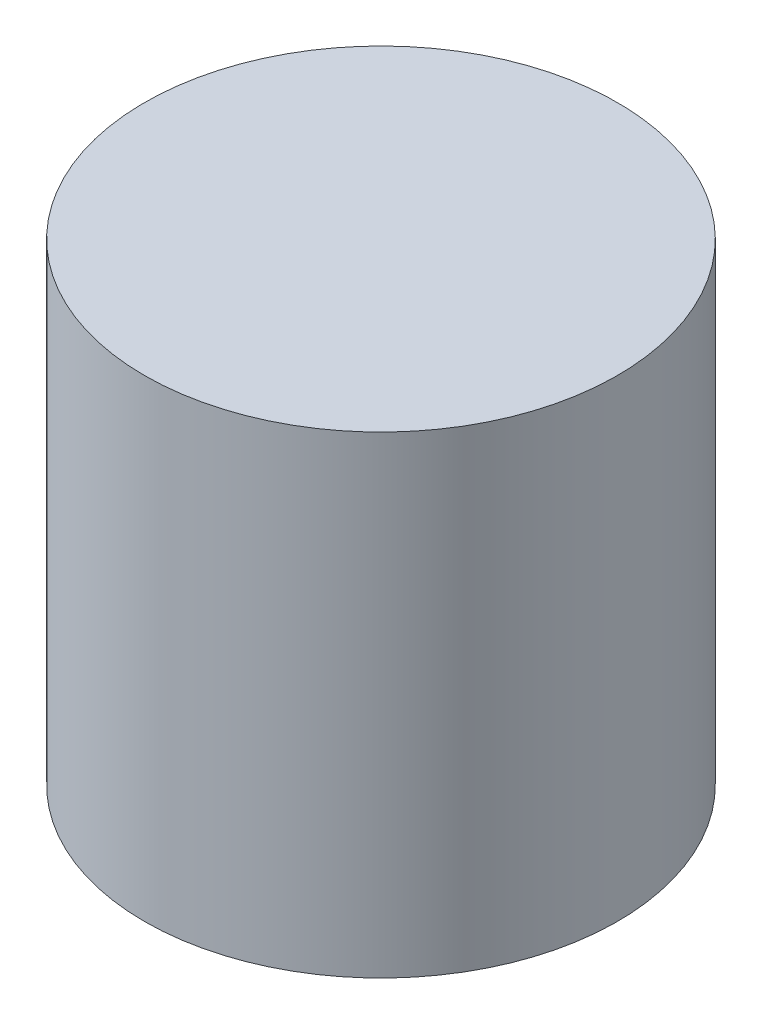
ISO-10303-21;
HEADER;
FILE_DESCRIPTION(('STEP AP214'),'2;1');
FILE_NAME('part.step','',(''),(''),'','','');
FILE_SCHEMA(('AUTOMOTIVE_DESIGN { 1 0 10303 214 1 1 1 1 }'));
ENDSEC;
DATA;
#1=APPLICATION_CONTEXT('core data for automotive mechanical design processes');
#2=APPLICATION_PROTOCOL_DEFINITION('international standard','automotive_design',2000,#1);
#3=PRODUCT_CONTEXT('',#1,'mechanical');
#4=PRODUCT('Part','Part','',(#3));
#5=PRODUCT_RELATED_PRODUCT_CATEGORY('part','',(#4));
#6=PRODUCT_DEFINITION_FORMATION('','',#4);
#7=PRODUCT_DEFINITION_CONTEXT('part definition',#1,'design');
#8=PRODUCT_DEFINITION('design','',#6,#7);
#9=PRODUCT_DEFINITION_SHAPE('','',#8);
#10=(LENGTH_UNIT() NAMED_UNIT(*) SI_UNIT(.MILLI.,.METRE.));
#11=(NAMED_UNIT(*) PLANE_ANGLE_UNIT() SI_UNIT($,.RADIAN.));
#12=(NAMED_UNIT(*) SI_UNIT($,.STERADIAN.) SOLID_ANGLE_UNIT());
#13=UNCERTAINTY_MEASURE_WITH_UNIT(LENGTH_MEASURE(1.E-05),#10,'distance_accuracy_value','');
#14=(GEOMETRIC_REPRESENTATION_CONTEXT(3) GLOBAL_UNCERTAINTY_ASSIGNED_CONTEXT((#13)) GLOBAL_UNIT_ASSIGNED_CONTEXT((#10,
#11,#12)) REPRESENTATION_CONTEXT('',''));
#15=CARTESIAN_POINT('',(0.,0.,0.));
#16=DIRECTION('',(0.,0.,1.));
#17=DIRECTION('',(1.,0.,0.));
#18=AXIS2_PLACEMENT_3D('',#15,#16,#17);
#19=CARTESIAN_POINT('',(0.,8.,0.));
#20=DIRECTION('',(0.,-1.,0.));
#21=DIRECTION('',(0.,0.,-1.));
#22=AXIS2_PLACEMENT_3D('',#19,#20,#21);
#23=CYLINDRICAL_SURFACE('',#22,4.);
#24=CARTESIAN_POINT('',(0.,8.,0.));
#25=DIRECTION('',(0.,1.,0.));
#26=DIRECTION('',(0.,0.,1.));
#27=AXIS2_PLACEMENT_3D('',#24,#25,#26);
#28=CIRCLE('',#27,4.);
#29=CARTESIAN_POINT('',(0.,8.,4.));
#30=VERTEX_POINT('',#29);
#31=EDGE_CURVE('E10',#30,#30,#28,.T.);
#32=ORIENTED_EDGE('',*,*,#31,.F.);
#33=EDGE_LOOP('',(#32));
#34=FACE_BOUND('',#33,.T.);
#35=CARTESIAN_POINT('',(0.,0.,0.));
#36=DIRECTION('',(0.,1.,0.));
#37=DIRECTION('',(0.,0.,1.));
#38=AXIS2_PLACEMENT_3D('',#35,#36,#37);
#39=CIRCLE('',#38,4.);
#40=CARTESIAN_POINT('',(0.,0.,4.));
#41=VERTEX_POINT('',#40);
#42=EDGE_CURVE('E44',#41,#41,#39,.T.);
#43=ORIENTED_EDGE('',*,*,#42,.T.);
#44=EDGE_LOOP('',(#43));
#45=FACE_BOUND('',#44,.T.);
#46=ADVANCED_FACE('F41',(#34,#45),#23,.T.);
#47=CARTESIAN_POINT('',(0.,8.,0.));
#48=DIRECTION('',(0.,1.,0.));
#49=DIRECTION('',(0.,0.,1.));
#50=AXIS2_PLACEMENT_3D('',#47,#48,#49);
#51=PLANE('',#50);
#52=ORIENTED_EDGE('',*,*,#31,.T.);
#53=EDGE_LOOP('',(#52));
#54=FACE_BOUND('',#53,.T.);
#55=ADVANCED_FACE('F58',(#54),#51,.T.);
#56=CARTESIAN_POINT('',(0.,0.,0.));
#57=DIRECTION('',(0.,1.,0.));
#58=DIRECTION('',(0.,0.,1.));
#59=AXIS2_PLACEMENT_3D('',#56,#57,#58);
#60=PLANE('',#59);
#61=ORIENTED_EDGE('',*,*,#42,.F.);
#62=EDGE_LOOP('',(#61));
#63=FACE_BOUND('',#62,.T.);
#64=ADVANCED_FACE('F56',(#63),#60,.F.);
#65=CLOSED_SHELL('',(#46,#55,#64));
#66=MANIFOLD_SOLID_BREP('B2',#65);
#67=ADVANCED_BREP_SHAPE_REPRESENTATION('',(#18,#66),#14);
#68=SHAPE_DEFINITION_REPRESENTATION(#9,#67);
ENDSEC;
END-ISO-10303-21;
